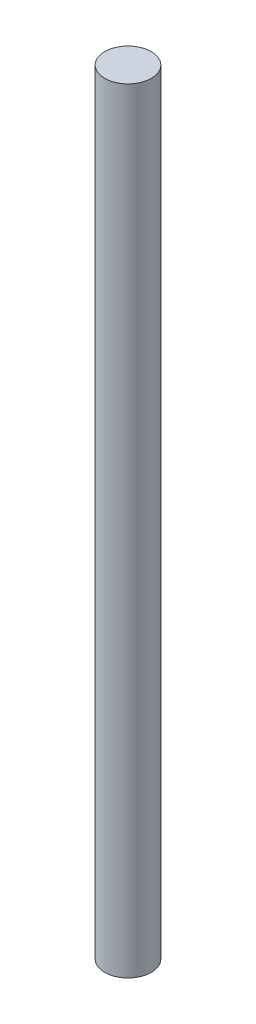
ISO-10303-21;
HEADER;
FILE_DESCRIPTION(('STEP AP214'),'2;1');
FILE_NAME('part.step','',(''),(''),'','','');
FILE_SCHEMA(('AUTOMOTIVE_DESIGN { 1 0 10303 214 1 1 1 1 }'));
ENDSEC;
DATA;
#1=APPLICATION_CONTEXT('core data for automotive mechanical design processes');
#2=APPLICATION_PROTOCOL_DEFINITION('international standard','automotive_design',2000,#1);
#3=PRODUCT_CONTEXT('',#1,'mechanical');
#4=PRODUCT('Part','Part','',(#3));
#5=PRODUCT_RELATED_PRODUCT_CATEGORY('part','',(#4));
#6=PRODUCT_DEFINITION_FORMATION('','',#4);
#7=PRODUCT_DEFINITION_CONTEXT('part definition',#1,'design');
#8=PRODUCT_DEFINITION('design','',#6,#7);
#9=PRODUCT_DEFINITION_SHAPE('','',#8);
#10=(LENGTH_UNIT() NAMED_UNIT(*) SI_UNIT(.MILLI.,.METRE.));
#11=(NAMED_UNIT(*) PLANE_ANGLE_UNIT() SI_UNIT($,.RADIAN.));
#12=(NAMED_UNIT(*) SI_UNIT($,.STERADIAN.) SOLID_ANGLE_UNIT());
#13=UNCERTAINTY_MEASURE_WITH_UNIT(LENGTH_MEASURE(1.E-05),#10,'distance_accuracy_value','');
#14=(GEOMETRIC_REPRESENTATION_CONTEXT(3) GLOBAL_UNCERTAINTY_ASSIGNED_CONTEXT((#13)) GLOBAL_UNIT_ASSIGNED_CONTEXT((#10,
#11,#12)) REPRESENTATION_CONTEXT('',''));
#15=CARTESIAN_POINT('',(0.,0.,0.));
#16=DIRECTION('',(0.,0.,1.));
#17=DIRECTION('',(1.,0.,0.));
#18=AXIS2_PLACEMENT_3D('',#15,#16,#17);
#19=CARTESIAN_POINT('',(0.,200.,0.));
#20=DIRECTION('',(0.,-1.,0.));
#21=DIRECTION('',(0.,0.,-1.));
#22=AXIS2_PLACEMENT_3D('',#19,#20,#21);
#23=CYLINDRICAL_SURFACE('',#22,6.);
#24=CARTESIAN_POINT('',(0.,200.,0.));
#25=DIRECTION('',(0.,1.,0.));
#26=DIRECTION('',(0.,0.,1.));
#27=AXIS2_PLACEMENT_3D('',#24,#25,#26);
#28=CIRCLE('',#27,6.);
#29=CARTESIAN_POINT('',(0.,200.,6.));
#30=VERTEX_POINT('',#29);
#31=EDGE_CURVE('E10',#30,#30,#28,.T.);
#32=ORIENTED_EDGE('',*,*,#31,.F.);
#33=EDGE_LOOP('',(#32));
#34=FACE_BOUND('',#33,.T.);
#35=CARTESIAN_POINT('',(0.,0.,0.));
#36=DIRECTION('',(0.,1.,0.));
#37=DIRECTION('',(0.,0.,1.));
#38=AXIS2_PLACEMENT_3D('',#35,#36,#37);
#39=CIRCLE('',#38,6.);
#40=CARTESIAN_POINT('',(0.,0.,6.));
#41=VERTEX_POINT('',#40);
#42=EDGE_CURVE('E39',#41,#41,#39,.T.);
#43=ORIENTED_EDGE('',*,*,#42,.T.);
#44=EDGE_LOOP('',(#43));
#45=FACE_BOUND('',#44,.T.);
#46=ADVANCED_FACE('F36',(#34,#45),#23,.T.);
#47=CARTESIAN_POINT('',(0.,200.,0.));
#48=DIRECTION('',(0.,1.,0.));
#49=DIRECTION('',(0.,0.,1.));
#50=AXIS2_PLACEMENT_3D('',#47,#48,#49);
#51=PLANE('',#50);
#52=ORIENTED_EDGE('',*,*,#31,.T.);
#53=EDGE_LOOP('',(#52));
#54=FACE_BOUND('',#53,.T.);
#55=ADVANCED_FACE('F51',(#54),#51,.T.);
#56=CARTESIAN_POINT('',(0.,0.,0.));
#57=DIRECTION('',(0.,1.,0.));
#58=DIRECTION('',(0.,0.,1.));
#59=AXIS2_PLACEMENT_3D('',#56,#57,#58);
#60=PLANE('',#59);
#61=ORIENTED_EDGE('',*,*,#42,.F.);
#62=EDGE_LOOP('',(#61));
#63=FACE_BOUND('',#62,.T.);
#64=ADVANCED_FACE('F49',(#63),#60,.F.);
#65=CLOSED_SHELL('',(#46,#55,#64));
#66=MANIFOLD_SOLID_BREP('B2',#65);
#67=ADVANCED_BREP_SHAPE_REPRESENTATION('',(#18,#66),#14);
#68=SHAPE_DEFINITION_REPRESENTATION(#9,#67);
ENDSEC;
END-ISO-10303-21;
